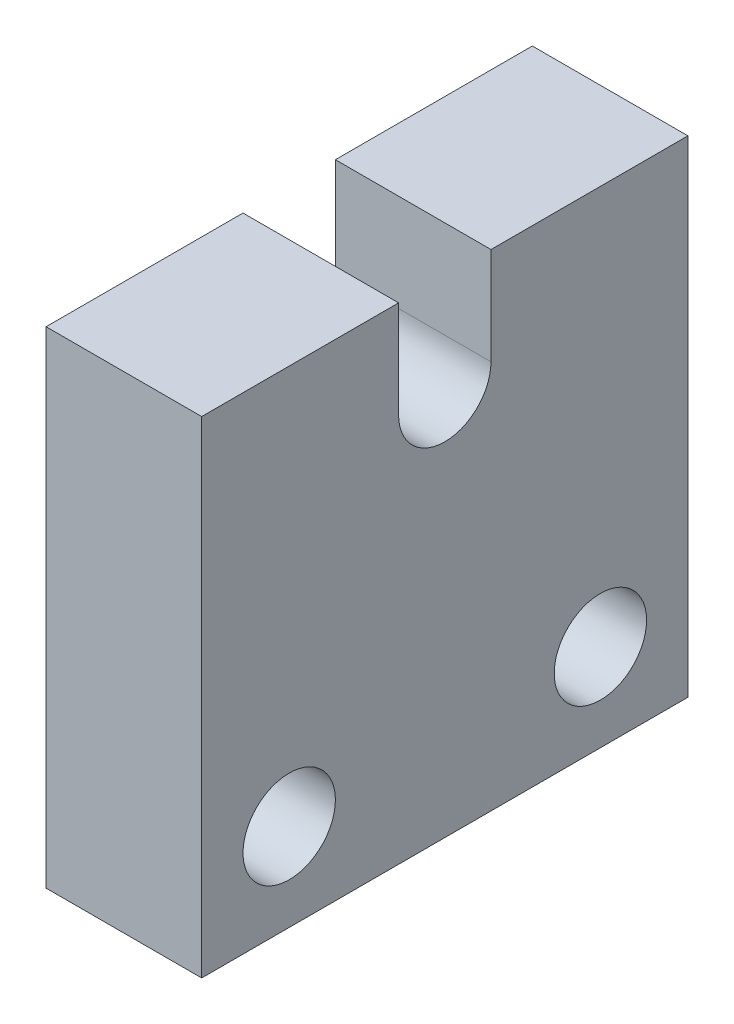
ISO-10303-21;
HEADER;
FILE_DESCRIPTION(('STEP AP214'),'2;1');
FILE_NAME('part.step','',(''),(''),'','','');
FILE_SCHEMA(('AUTOMOTIVE_DESIGN { 1 0 10303 214 1 1 1 1 }'));
ENDSEC;
DATA;
#1=APPLICATION_CONTEXT('core data for automotive mechanical design processes');
#2=APPLICATION_PROTOCOL_DEFINITION('international standard','automotive_design',2000,#1);
#3=PRODUCT_CONTEXT('',#1,'mechanical');
#4=PRODUCT('Part','Part','',(#3));
#5=PRODUCT_RELATED_PRODUCT_CATEGORY('part','',(#4));
#6=PRODUCT_DEFINITION_FORMATION('','',#4);
#7=PRODUCT_DEFINITION_CONTEXT('part definition',#1,'design');
#8=PRODUCT_DEFINITION('design','',#6,#7);
#9=PRODUCT_DEFINITION_SHAPE('','',#8);
#10=(LENGTH_UNIT() NAMED_UNIT(*) SI_UNIT(.MILLI.,.METRE.));
#11=(NAMED_UNIT(*) PLANE_ANGLE_UNIT() SI_UNIT($,.RADIAN.));
#12=(NAMED_UNIT(*) SI_UNIT($,.STERADIAN.) SOLID_ANGLE_UNIT());
#13=UNCERTAINTY_MEASURE_WITH_UNIT(LENGTH_MEASURE(1.E-05),#10,'distance_accuracy_value','');
#14=(GEOMETRIC_REPRESENTATION_CONTEXT(3) GLOBAL_UNCERTAINTY_ASSIGNED_CONTEXT((#13)) GLOBAL_UNIT_ASSIGNED_CONTEXT((#10,
#11,#12)) REPRESENTATION_CONTEXT('',''));
#15=CARTESIAN_POINT('',(0.,0.,0.));
#16=DIRECTION('',(0.,0.,1.));
#17=DIRECTION('',(1.,0.,0.));
#18=AXIS2_PLACEMENT_3D('',#15,#16,#17);
#19=CARTESIAN_POINT('',(-8.,0.,0.));
#20=DIRECTION('',(1.,0.,0.));
#21=DIRECTION('',(0.,0.,-1.));
#22=AXIS2_PLACEMENT_3D('',#19,#20,#21);
#23=PLANE('',#22);
#24=CARTESIAN_POINT('',(-8.,9.,-16.));
#25=DIRECTION('',(1.,0.,0.));
#26=DIRECTION('',(0.,0.,-1.));
#27=AXIS2_PLACEMENT_3D('',#24,#25,#26);
#28=CIRCLE('',#27,4.75);
#29=CARTESIAN_POINT('',(-8.,9.,-20.75));
#30=VERTEX_POINT('',#29);
#31=EDGE_CURVE('E118',#30,#30,#28,.T.);
#32=ORIENTED_EDGE('',*,*,#31,.T.);
#33=EDGE_LOOP('',(#32));
#34=FACE_BOUND('',#33,.T.);
#35=CARTESIAN_POINT('',(-8.,9.,16.));
#36=DIRECTION('',(1.,0.,0.));
#37=DIRECTION('',(0.,0.,-1.));
#38=AXIS2_PLACEMENT_3D('',#35,#36,#37);
#39=CIRCLE('',#38,4.75);
#40=CARTESIAN_POINT('',(-8.,9.,11.25));
#41=VERTEX_POINT('',#40);
#42=EDGE_CURVE('E115',#41,#41,#39,.T.);
#43=ORIENTED_EDGE('',*,*,#42,.T.);
#44=EDGE_LOOP('',(#43));
#45=FACE_BOUND('',#44,.T.);
#46=CARTESIAN_POINT('',(-8.,40.,0.));
#47=DIRECTION('',(1.,0.,0.));
#48=DIRECTION('',(0.,0.,-1.));
#49=AXIS2_PLACEMENT_3D('',#46,#47,#48);
#50=CIRCLE('',#49,4.75);
#51=CARTESIAN_POINT('',(-8.,40.,4.75));
#52=VERTEX_POINT('',#51);
#53=CARTESIAN_POINT('',(-8.,40.,-4.75));
#54=VERTEX_POINT('',#53);
#55=EDGE_CURVE('E20',#52,#54,#50,.T.);
#56=ORIENTED_EDGE('',*,*,#55,.T.);
#57=DIRECTION('',(0.,1.,0.));
#58=VECTOR('',#57,1.);
#59=CARTESIAN_POINT('',(-8.,40.,-4.75));
#60=LINE('',#59,#58);
#61=CARTESIAN_POINT('',(-8.,50.,-4.75));
#62=VERTEX_POINT('',#61);
#63=EDGE_CURVE('E58',#54,#62,#60,.T.);
#64=ORIENTED_EDGE('',*,*,#63,.T.);
#65=DIRECTION('',(0.,0.,1.));
#66=VECTOR('',#65,1.);
#67=CARTESIAN_POINT('',(-8.,50.,-25.));
#68=LINE('',#67,#66);
#69=CARTESIAN_POINT('',(-8.,50.,-25.));
#70=VERTEX_POINT('',#69);
#71=EDGE_CURVE('E65',#70,#62,#68,.T.);
#72=ORIENTED_EDGE('',*,*,#71,.F.);
#73=DIRECTION('',(0.,1.,0.));
#74=VECTOR('',#73,1.);
#75=CARTESIAN_POINT('',(-8.,0.,-25.));
#76=LINE('',#75,#74);
#77=CARTESIAN_POINT('',(-8.,0.,-25.));
#78=VERTEX_POINT('',#77);
#79=EDGE_CURVE('E152',#78,#70,#76,.T.);
#80=ORIENTED_EDGE('',*,*,#79,.F.);
#81=DIRECTION('',(0.,0.,-1.));
#82=VECTOR('',#81,1.);
#83=CARTESIAN_POINT('',(-8.,0.,25.));
#84=LINE('',#83,#82);
#85=CARTESIAN_POINT('',(-8.,0.,25.));
#86=VERTEX_POINT('',#85);
#87=EDGE_CURVE('E162',#86,#78,#84,.T.);
#88=ORIENTED_EDGE('',*,*,#87,.F.);
#89=DIRECTION('',(0.,1.,0.));
#90=VECTOR('',#89,1.);
#91=CARTESIAN_POINT('',(-8.,50.,25.));
#92=LINE('',#91,#90);
#93=CARTESIAN_POINT('',(-8.,50.,25.));
#94=VERTEX_POINT('',#93);
#95=EDGE_CURVE('E169',#94,#86,#92,.F.);
#96=ORIENTED_EDGE('',*,*,#95,.F.);
#97=DIRECTION('',(0.,0.,1.));
#98=VECTOR('',#97,1.);
#99=CARTESIAN_POINT('',(-8.,50.,-25.));
#100=LINE('',#99,#98);
#101=CARTESIAN_POINT('',(-8.,50.,4.75));
#102=VERTEX_POINT('',#101);
#103=EDGE_CURVE('E99',#102,#94,#100,.T.);
#104=ORIENTED_EDGE('',*,*,#103,.F.);
#105=DIRECTION('',(0.,1.,0.));
#106=VECTOR('',#105,1.);
#107=CARTESIAN_POINT('',(-8.,50.,4.75));
#108=LINE('',#107,#106);
#109=EDGE_CURVE('E53',#102,#52,#108,.F.);
#110=ORIENTED_EDGE('',*,*,#109,.T.);
#111=EDGE_LOOP('',(#56,#64,#72,#80,#88,#96,#104,#110));
#112=FACE_BOUND('',#111,.T.);
#113=ADVANCED_FACE('F17',(#34,#45,#112),#23,.F.);
#114=CARTESIAN_POINT('',(8.,50.,4.75));
#115=DIRECTION('',(0.,0.,1.));
#116=DIRECTION('',(1.,0.,0.));
#117=AXIS2_PLACEMENT_3D('',#114,#115,#116);
#118=PLANE('',#117);
#119=DIRECTION('',(1.,0.,0.));
#120=VECTOR('',#119,1.);
#121=CARTESIAN_POINT('',(8.,50.,4.75));
#122=LINE('',#121,#120);
#123=CARTESIAN_POINT('',(8.,50.,4.75));
#124=VERTEX_POINT('',#123);
#125=EDGE_CURVE('E91',#124,#102,#122,.F.);
#126=ORIENTED_EDGE('',*,*,#125,.F.);
#127=DIRECTION('',(0.,1.,0.));
#128=VECTOR('',#127,1.);
#129=CARTESIAN_POINT('',(8.,0.,4.75));
#130=LINE('',#129,#128);
#131=CARTESIAN_POINT('',(8.,40.,4.75));
#132=VERTEX_POINT('',#131);
#133=EDGE_CURVE('E95',#132,#124,#130,.T.);
#134=ORIENTED_EDGE('',*,*,#133,.F.);
#135=DIRECTION('',(1.,0.,0.));
#136=VECTOR('',#135,1.);
#137=CARTESIAN_POINT('',(8.,40.,4.75));
#138=LINE('',#137,#136);
#139=EDGE_CURVE('E127',#132,#52,#138,.F.);
#140=ORIENTED_EDGE('',*,*,#139,.T.);
#141=ORIENTED_EDGE('',*,*,#109,.F.);
#142=EDGE_LOOP('',(#126,#134,#140,#141));
#143=FACE_BOUND('',#142,.T.);
#144=ADVANCED_FACE('F93',(#143),#118,.F.);
#145=CARTESIAN_POINT('',(8.,50.,-25.));
#146=DIRECTION('',(0.,1.,0.));
#147=DIRECTION('',(0.,0.,1.));
#148=AXIS2_PLACEMENT_3D('',#145,#146,#147);
#149=PLANE('',#148);
#150=DIRECTION('',(1.,0.,0.));
#151=VECTOR('',#150,1.);
#152=CARTESIAN_POINT('',(8.,50.,25.));
#153=LINE('',#152,#151);
#154=CARTESIAN_POINT('',(8.,50.,25.));
#155=VERTEX_POINT('',#154);
#156=EDGE_CURVE('E105',#155,#94,#153,.F.);
#157=ORIENTED_EDGE('',*,*,#156,.F.);
#158=DIRECTION('',(0.,0.,-1.));
#159=VECTOR('',#158,1.);
#160=CARTESIAN_POINT('',(8.,50.,0.));
#161=LINE('',#160,#159);
#162=EDGE_CURVE('E102',#124,#155,#161,.F.);
#163=ORIENTED_EDGE('',*,*,#162,.F.);
#164=ORIENTED_EDGE('',*,*,#125,.T.);
#165=ORIENTED_EDGE('',*,*,#103,.T.);
#166=EDGE_LOOP('',(#157,#163,#164,#165));
#167=FACE_BOUND('',#166,.T.);
#168=ADVANCED_FACE('F103',(#167),#149,.T.);
#169=CARTESIAN_POINT('',(8.,50.,25.));
#170=DIRECTION('',(0.,0.,1.));
#171=DIRECTION('',(1.,0.,0.));
#172=AXIS2_PLACEMENT_3D('',#169,#170,#171);
#173=PLANE('',#172);
#174=DIRECTION('',(0.,1.,0.));
#175=VECTOR('',#174,1.);
#176=CARTESIAN_POINT('',(8.,0.,25.));
#177=LINE('',#176,#175);
#178=CARTESIAN_POINT('',(8.,0.,25.));
#179=VERTEX_POINT('',#178);
#180=EDGE_CURVE('E109',#155,#179,#177,.F.);
#181=ORIENTED_EDGE('',*,*,#180,.F.);
#182=ORIENTED_EDGE('',*,*,#156,.T.);
#183=ORIENTED_EDGE('',*,*,#95,.T.);
#184=DIRECTION('',(1.,0.,0.));
#185=VECTOR('',#184,1.);
#186=CARTESIAN_POINT('',(8.,0.,25.));
#187=LINE('',#186,#185);
#188=EDGE_CURVE('E159',#179,#86,#187,.F.);
#189=ORIENTED_EDGE('',*,*,#188,.F.);
#190=EDGE_LOOP('',(#181,#182,#183,#189));
#191=FACE_BOUND('',#190,.T.);
#192=ADVANCED_FACE('F217',(#191),#173,.T.);
#193=CARTESIAN_POINT('',(8.,0.,25.));
#194=DIRECTION('',(0.,-1.,0.));
#195=DIRECTION('',(0.,0.,-1.));
#196=AXIS2_PLACEMENT_3D('',#193,#194,#195);
#197=PLANE('',#196);
#198=DIRECTION('',(0.,0.,-1.));
#199=VECTOR('',#198,1.);
#200=CARTESIAN_POINT('',(8.,0.,0.));
#201=LINE('',#200,#199);
#202=CARTESIAN_POINT('',(8.,0.,-25.));
#203=VERTEX_POINT('',#202);
#204=EDGE_CURVE('E147',#179,#203,#201,.T.);
#205=ORIENTED_EDGE('',*,*,#204,.F.);
#206=ORIENTED_EDGE('',*,*,#188,.T.);
#207=ORIENTED_EDGE('',*,*,#87,.T.);
#208=DIRECTION('',(-1.,0.,0.));
#209=VECTOR('',#208,1.);
#210=CARTESIAN_POINT('',(8.,0.,-25.));
#211=LINE('',#210,#209);
#212=EDGE_CURVE('E142',#203,#78,#211,.T.);
#213=ORIENTED_EDGE('',*,*,#212,.F.);
#214=EDGE_LOOP('',(#205,#206,#207,#213));
#215=FACE_BOUND('',#214,.T.);
#216=ADVANCED_FACE('F215',(#215),#197,.T.);
#217=CARTESIAN_POINT('',(8.,0.,-25.));
#218=DIRECTION('',(0.,0.,-1.));
#219=DIRECTION('',(-1.,0.,0.));
#220=AXIS2_PLACEMENT_3D('',#217,#218,#219);
#221=PLANE('',#220);
#222=DIRECTION('',(0.,1.,0.));
#223=VECTOR('',#222,1.);
#224=CARTESIAN_POINT('',(8.,0.,-25.));
#225=LINE('',#224,#223);
#226=CARTESIAN_POINT('',(8.,50.,-25.));
#227=VERTEX_POINT('',#226);
#228=EDGE_CURVE('E137',#203,#227,#225,.T.);
#229=ORIENTED_EDGE('',*,*,#228,.F.);
#230=ORIENTED_EDGE('',*,*,#212,.T.);
#231=ORIENTED_EDGE('',*,*,#79,.T.);
#232=DIRECTION('',(1.,0.,0.));
#233=VECTOR('',#232,1.);
#234=CARTESIAN_POINT('',(8.,50.,-25.));
#235=LINE('',#234,#233);
#236=EDGE_CURVE('E140',#227,#70,#235,.F.);
#237=ORIENTED_EDGE('',*,*,#236,.F.);
#238=EDGE_LOOP('',(#229,#230,#231,#237));
#239=FACE_BOUND('',#238,.T.);
#240=ADVANCED_FACE('F213',(#239),#221,.T.);
#241=CARTESIAN_POINT('',(8.,50.,-25.));
#242=DIRECTION('',(0.,1.,0.));
#243=DIRECTION('',(0.,0.,1.));
#244=AXIS2_PLACEMENT_3D('',#241,#242,#243);
#245=PLANE('',#244);
#246=ORIENTED_EDGE('',*,*,#236,.T.);
#247=ORIENTED_EDGE('',*,*,#71,.T.);
#248=DIRECTION('',(-1.,0.,0.));
#249=VECTOR('',#248,1.);
#250=CARTESIAN_POINT('',(8.,50.,-4.75));
#251=LINE('',#250,#249);
#252=CARTESIAN_POINT('',(8.,50.,-4.75));
#253=VERTEX_POINT('',#252);
#254=EDGE_CURVE('E129',#62,#253,#251,.F.);
#255=ORIENTED_EDGE('',*,*,#254,.T.);
#256=DIRECTION('',(0.,0.,-1.));
#257=VECTOR('',#256,1.);
#258=CARTESIAN_POINT('',(8.,50.,0.));
#259=LINE('',#258,#257);
#260=EDGE_CURVE('E133',#227,#253,#259,.F.);
#261=ORIENTED_EDGE('',*,*,#260,.F.);
#262=EDGE_LOOP('',(#246,#247,#255,#261));
#263=FACE_BOUND('',#262,.T.);
#264=ADVANCED_FACE('F209',(#263),#245,.T.);
#265=CARTESIAN_POINT('',(8.,40.,-4.75));
#266=DIRECTION('',(0.,0.,-1.));
#267=DIRECTION('',(-1.,0.,0.));
#268=AXIS2_PLACEMENT_3D('',#265,#266,#267);
#269=PLANE('',#268);
#270=DIRECTION('',(1.,0.,0.));
#271=VECTOR('',#270,1.);
#272=CARTESIAN_POINT('',(8.,40.,-4.75));
#273=LINE('',#272,#271);
#274=CARTESIAN_POINT('',(8.,40.,-4.75));
#275=VERTEX_POINT('',#274);
#276=EDGE_CURVE('E35',#54,#275,#273,.T.);
#277=ORIENTED_EDGE('',*,*,#276,.T.);
#278=DIRECTION('',(0.,1.,0.));
#279=VECTOR('',#278,1.);
#280=CARTESIAN_POINT('',(8.,0.,-4.75));
#281=LINE('',#280,#279);
#282=EDGE_CURVE('E136',#253,#275,#281,.F.);
#283=ORIENTED_EDGE('',*,*,#282,.F.);
#284=ORIENTED_EDGE('',*,*,#254,.F.);
#285=ORIENTED_EDGE('',*,*,#63,.F.);
#286=EDGE_LOOP('',(#277,#283,#284,#285));
#287=FACE_BOUND('',#286,.T.);
#288=ADVANCED_FACE('F208',(#287),#269,.F.);
#289=CARTESIAN_POINT('',(8.,40.,0.));
#290=DIRECTION('',(1.,0.,0.));
#291=DIRECTION('',(0.,0.,-1.));
#292=AXIS2_PLACEMENT_3D('',#289,#290,#291);
#293=CYLINDRICAL_SURFACE('',#292,4.75);
#294=ORIENTED_EDGE('',*,*,#139,.F.);
#295=CARTESIAN_POINT('',(8.,40.,0.));
#296=DIRECTION('',(1.,0.,0.));
#297=DIRECTION('',(0.,0.,-1.));
#298=AXIS2_PLACEMENT_3D('',#295,#296,#297);
#299=CIRCLE('',#298,4.75);
#300=EDGE_CURVE('E114',#275,#132,#299,.F.);
#301=ORIENTED_EDGE('',*,*,#300,.F.);
#302=ORIENTED_EDGE('',*,*,#276,.F.);
#303=ORIENTED_EDGE('',*,*,#55,.F.);
#304=EDGE_LOOP('',(#294,#301,#302,#303));
#305=FACE_BOUND('',#304,.T.);
#306=ADVANCED_FACE('F206',(#305),#293,.F.);
#307=CARTESIAN_POINT('',(8.,9.,-16.));
#308=DIRECTION('',(1.,0.,0.));
#309=DIRECTION('',(0.,0.,-1.));
#310=AXIS2_PLACEMENT_3D('',#307,#308,#309);
#311=CYLINDRICAL_SURFACE('',#310,4.75);
#312=CARTESIAN_POINT('',(8.,9.,-16.));
#313=DIRECTION('',(1.,0.,0.));
#314=DIRECTION('',(0.,0.,-1.));
#315=AXIS2_PLACEMENT_3D('',#312,#313,#314);
#316=CIRCLE('',#315,4.75);
#317=CARTESIAN_POINT('',(8.,9.,-20.75));
#318=VERTEX_POINT('',#317);
#319=EDGE_CURVE('E26',#318,#318,#316,.F.);
#320=ORIENTED_EDGE('',*,*,#319,.F.);
#321=EDGE_LOOP('',(#320));
#322=FACE_BOUND('',#321,.T.);
#323=ORIENTED_EDGE('',*,*,#31,.F.);
#324=EDGE_LOOP('',(#323));
#325=FACE_BOUND('',#324,.T.);
#326=ADVANCED_FACE('F234',(#322,#325),#311,.F.);
#327=CARTESIAN_POINT('',(8.,9.,16.));
#328=DIRECTION('',(1.,0.,0.));
#329=DIRECTION('',(0.,0.,-1.));
#330=AXIS2_PLACEMENT_3D('',#327,#328,#329);
#331=CYLINDRICAL_SURFACE('',#330,4.75);
#332=CARTESIAN_POINT('',(8.,9.,16.));
#333=DIRECTION('',(1.,0.,0.));
#334=DIRECTION('',(0.,0.,-1.));
#335=AXIS2_PLACEMENT_3D('',#332,#333,#334);
#336=CIRCLE('',#335,4.75);
#337=CARTESIAN_POINT('',(8.,9.,11.25));
#338=VERTEX_POINT('',#337);
#339=EDGE_CURVE('E11',#338,#338,#336,.F.);
#340=ORIENTED_EDGE('',*,*,#339,.F.);
#341=EDGE_LOOP('',(#340));
#342=FACE_BOUND('',#341,.T.);
#343=ORIENTED_EDGE('',*,*,#42,.F.);
#344=EDGE_LOOP('',(#343));
#345=FACE_BOUND('',#344,.T.);
#346=ADVANCED_FACE('F228',(#342,#345),#331,.F.);
#347=CARTESIAN_POINT('',(8.,0.,0.));
#348=DIRECTION('',(1.,0.,0.));
#349=DIRECTION('',(0.,0.,-1.));
#350=AXIS2_PLACEMENT_3D('',#347,#348,#349);
#351=PLANE('',#350);
#352=ORIENTED_EDGE('',*,*,#339,.T.);
#353=EDGE_LOOP('',(#352));
#354=FACE_BOUND('',#353,.T.);
#355=ORIENTED_EDGE('',*,*,#319,.T.);
#356=EDGE_LOOP('',(#355));
#357=FACE_BOUND('',#356,.T.);
#358=ORIENTED_EDGE('',*,*,#282,.T.);
#359=ORIENTED_EDGE('',*,*,#300,.T.);
#360=ORIENTED_EDGE('',*,*,#133,.T.);
#361=ORIENTED_EDGE('',*,*,#162,.T.);
#362=ORIENTED_EDGE('',*,*,#180,.T.);
#363=ORIENTED_EDGE('',*,*,#204,.T.);
#364=ORIENTED_EDGE('',*,*,#228,.T.);
#365=ORIENTED_EDGE('',*,*,#260,.T.);
#366=EDGE_LOOP('',(#358,#359,#360,#361,#362,#363,#364,#365));
#367=FACE_BOUND('',#366,.T.);
#368=ADVANCED_FACE('F113',(#354,#357,#367),#351,.T.);
#369=CLOSED_SHELL('',(#113,#144,#168,#192,#216,#240,#264,#288,#306,#326,#346,#368));
#370=MANIFOLD_SOLID_BREP('B1',#369);
#371=ADVANCED_BREP_SHAPE_REPRESENTATION('',(#18,#370),#14);
#372=SHAPE_DEFINITION_REPRESENTATION(#9,#371);
ENDSEC;
END-ISO-10303-21;
